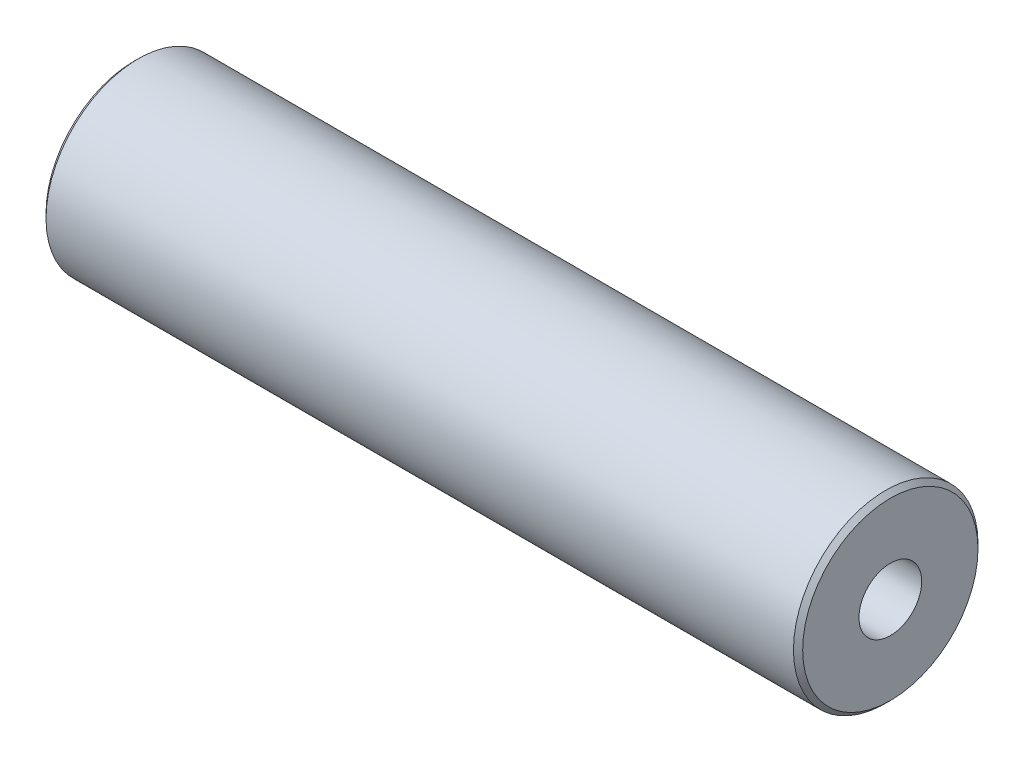
ISO-10303-21;
HEADER;
FILE_DESCRIPTION(('STEP AP214'),'2;1');
FILE_NAME('part.step','',(''),(''),'','','');
FILE_SCHEMA(('AUTOMOTIVE_DESIGN { 1 0 10303 214 1 1 1 1 }'));
ENDSEC;
DATA;
#1=APPLICATION_CONTEXT('core data for automotive mechanical design processes');
#2=APPLICATION_PROTOCOL_DEFINITION('international standard','automotive_design',2000,#1);
#3=PRODUCT_CONTEXT('',#1,'mechanical');
#4=PRODUCT('Part','Part','',(#3));
#5=PRODUCT_RELATED_PRODUCT_CATEGORY('part','',(#4));
#6=PRODUCT_DEFINITION_FORMATION('','',#4);
#7=PRODUCT_DEFINITION_CONTEXT('part definition',#1,'design');
#8=PRODUCT_DEFINITION('design','',#6,#7);
#9=PRODUCT_DEFINITION_SHAPE('','',#8);
#10=(LENGTH_UNIT() NAMED_UNIT(*) SI_UNIT(.MILLI.,.METRE.));
#11=(NAMED_UNIT(*) PLANE_ANGLE_UNIT() SI_UNIT($,.RADIAN.));
#12=(NAMED_UNIT(*) SI_UNIT($,.STERADIAN.) SOLID_ANGLE_UNIT());
#13=UNCERTAINTY_MEASURE_WITH_UNIT(LENGTH_MEASURE(1.E-05),#10,'distance_accuracy_value','');
#14=(GEOMETRIC_REPRESENTATION_CONTEXT(3) GLOBAL_UNCERTAINTY_ASSIGNED_CONTEXT((#13)) GLOBAL_UNIT_ASSIGNED_CONTEXT((#10,
#11,#12)) REPRESENTATION_CONTEXT('',''));
#15=CARTESIAN_POINT('',(0.,0.,0.));
#16=DIRECTION('',(0.,0.,1.));
#17=DIRECTION('',(1.,0.,0.));
#18=AXIS2_PLACEMENT_3D('',#15,#16,#17);
#19=CARTESIAN_POINT('',(41.,0.,0.));
#20=DIRECTION('',(-1.,0.,0.));
#21=DIRECTION('',(0.,0.,1.));
#22=AXIS2_PLACEMENT_3D('',#19,#20,#21);
#23=CYLINDRICAL_SURFACE('',#22,10.);
#24=CARTESIAN_POINT('',(40.5,0.,0.));
#25=DIRECTION('',(1.,0.,0.));
#26=DIRECTION('',(0.,0.,-1.));
#27=AXIS2_PLACEMENT_3D('',#24,#25,#26);
#28=CIRCLE('',#27,10.);
#29=CARTESIAN_POINT('',(40.5,0.,-10.));
#30=VERTEX_POINT('',#29);
#31=EDGE_CURVE('E75',#30,#30,#28,.F.);
#32=ORIENTED_EDGE('',*,*,#31,.T.);
#33=EDGE_LOOP('',(#32));
#34=FACE_BOUND('',#33,.T.);
#35=CARTESIAN_POINT('',(-40.5,0.,0.));
#36=DIRECTION('',(1.,0.,0.));
#37=DIRECTION('',(0.,0.,-1.));
#38=AXIS2_PLACEMENT_3D('',#35,#36,#37);
#39=CIRCLE('',#38,10.);
#40=CARTESIAN_POINT('',(-40.5,0.,-10.));
#41=VERTEX_POINT('',#40);
#42=EDGE_CURVE('E111',#41,#41,#39,.T.);
#43=ORIENTED_EDGE('',*,*,#42,.T.);
#44=EDGE_LOOP('',(#43));
#45=FACE_BOUND('',#44,.T.);
#46=ADVANCED_FACE('F65',(#34,#45),#23,.T.);
#47=CARTESIAN_POINT('',(41.,0.,0.));
#48=DIRECTION('',(1.,0.,0.));
#49=DIRECTION('',(0.,0.,-1.));
#50=AXIS2_PLACEMENT_3D('',#47,#48,#49);
#51=PLANE('',#50);
#52=CARTESIAN_POINT('',(41.,0.,0.));
#53=DIRECTION('',(1.,0.,0.));
#54=DIRECTION('',(0.,0.,-1.));
#55=AXIS2_PLACEMENT_3D('',#52,#53,#54);
#56=CIRCLE('',#55,3.4);
#57=CARTESIAN_POINT('',(41.,0.,-3.4));
#58=VERTEX_POINT('',#57);
#59=EDGE_CURVE('E92',#58,#58,#56,.T.);
#60=ORIENTED_EDGE('',*,*,#59,.F.);
#61=EDGE_LOOP('',(#60));
#62=FACE_BOUND('',#61,.T.);
#63=CARTESIAN_POINT('',(41.,0.,0.));
#64=DIRECTION('',(1.,0.,0.));
#65=DIRECTION('',(0.,0.,-1.));
#66=AXIS2_PLACEMENT_3D('',#63,#64,#65);
#67=CIRCLE('',#66,9.5);
#68=CARTESIAN_POINT('',(41.,0.,-9.5));
#69=VERTEX_POINT('',#68);
#70=EDGE_CURVE('E107',#69,#69,#67,.T.);
#71=ORIENTED_EDGE('',*,*,#70,.T.);
#72=EDGE_LOOP('',(#71));
#73=FACE_BOUND('',#72,.T.);
#74=ADVANCED_FACE('F127',(#62,#73),#51,.T.);
#75=CARTESIAN_POINT('',(-41.,0.,0.));
#76=DIRECTION('',(1.,0.,0.));
#77=DIRECTION('',(0.,0.,-1.));
#78=AXIS2_PLACEMENT_3D('',#75,#76,#77);
#79=PLANE('',#78);
#80=CARTESIAN_POINT('',(-41.,0.,0.));
#81=DIRECTION('',(-1.,0.,0.));
#82=DIRECTION('',(0.,0.,1.));
#83=AXIS2_PLACEMENT_3D('',#80,#81,#82);
#84=CIRCLE('',#83,3.39999999999999);
#85=CARTESIAN_POINT('',(-41.,0.,3.39999999999999));
#86=VERTEX_POINT('',#85);
#87=EDGE_CURVE('E93',#86,#86,#84,.T.);
#88=ORIENTED_EDGE('',*,*,#87,.F.);
#89=EDGE_LOOP('',(#88));
#90=FACE_BOUND('',#89,.T.);
#91=CARTESIAN_POINT('',(-41.,0.,0.));
#92=DIRECTION('',(1.,0.,0.));
#93=DIRECTION('',(0.,0.,-1.));
#94=AXIS2_PLACEMENT_3D('',#91,#92,#93);
#95=CIRCLE('',#94,9.49999999999999);
#96=CARTESIAN_POINT('',(-41.,0.,-9.49999999999999));
#97=VERTEX_POINT('',#96);
#98=EDGE_CURVE('E13',#97,#97,#95,.F.);
#99=ORIENTED_EDGE('',*,*,#98,.T.);
#100=EDGE_LOOP('',(#99));
#101=FACE_BOUND('',#100,.T.);
#102=ADVANCED_FACE('F124',(#90,#101),#79,.F.);
#103=CARTESIAN_POINT('',(41.,0.,0.));
#104=DIRECTION('',(-1.,0.,0.));
#105=DIRECTION('',(0.,0.,1.));
#106=AXIS2_PLACEMENT_3D('',#103,#104,#105);
#107=CONICAL_SURFACE('',#106,9.5,0.785398163397447);
#108=ORIENTED_EDGE('',*,*,#31,.F.);
#109=EDGE_LOOP('',(#108));
#110=FACE_BOUND('',#109,.T.);
#111=ORIENTED_EDGE('',*,*,#70,.F.);
#112=EDGE_LOOP('',(#111));
#113=FACE_BOUND('',#112,.T.);
#114=ADVANCED_FACE('F121',(#110,#113),#107,.T.);
#115=CARTESIAN_POINT('',(-40.5,0.,0.));
#116=DIRECTION('',(1.,0.,0.));
#117=DIRECTION('',(0.,0.,-1.));
#118=AXIS2_PLACEMENT_3D('',#115,#116,#117);
#119=CONICAL_SURFACE('',#118,10.,0.785398163397447);
#120=ORIENTED_EDGE('',*,*,#98,.F.);
#121=EDGE_LOOP('',(#120));
#122=FACE_BOUND('',#121,.T.);
#123=ORIENTED_EDGE('',*,*,#42,.F.);
#124=EDGE_LOOP('',(#123));
#125=FACE_BOUND('',#124,.T.);
#126=ADVANCED_FACE('F68',(#122,#125),#119,.T.);
#127=CARTESIAN_POINT('',(18.75,0.,0.));
#128=DIRECTION('',(1.,0.,0.));
#129=DIRECTION('',(0.,0.,-1.));
#130=AXIS2_PLACEMENT_3D('',#127,#128,#129);
#131=CONICAL_SURFACE('',#130,3.4,1.02974425867665);
#132=CARTESIAN_POINT('',(16.7070738953063,0.,0.));
#133=VERTEX_POINT('',#132);
#134=VERTEX_LOOP('',#133);
#135=FACE_BOUND('',#134,.T.);
#136=CARTESIAN_POINT('',(18.75,0.,0.));
#137=DIRECTION('',(1.,0.,0.));
#138=DIRECTION('',(0.,0.,-1.));
#139=AXIS2_PLACEMENT_3D('',#136,#137,#138);
#140=CIRCLE('',#139,3.4);
#141=CARTESIAN_POINT('',(18.75,0.,-3.4));
#142=VERTEX_POINT('',#141);
#143=EDGE_CURVE('E99',#142,#142,#140,.T.);
#144=ORIENTED_EDGE('',*,*,#143,.T.);
#145=EDGE_LOOP('',(#144));
#146=FACE_BOUND('',#145,.T.);
#147=ADVANCED_FACE('F141',(#135,#146),#131,.F.);
#148=CARTESIAN_POINT('',(41.,0.,0.));
#149=DIRECTION('',(1.,0.,0.));
#150=DIRECTION('',(0.,0.,-1.));
#151=AXIS2_PLACEMENT_3D('',#148,#149,#150);
#152=CYLINDRICAL_SURFACE('',#151,3.4);
#153=ORIENTED_EDGE('',*,*,#143,.F.);
#154=EDGE_LOOP('',(#153));
#155=FACE_BOUND('',#154,.T.);
#156=ORIENTED_EDGE('',*,*,#59,.T.);
#157=EDGE_LOOP('',(#156));
#158=FACE_BOUND('',#157,.T.);
#159=ADVANCED_FACE('F85',(#155,#158),#152,.F.);
#160=CARTESIAN_POINT('',(-18.75,0.,0.));
#161=DIRECTION('',(-1.,0.,0.));
#162=DIRECTION('',(0.,0.,1.));
#163=AXIS2_PLACEMENT_3D('',#160,#161,#162);
#164=CONICAL_SURFACE('',#163,3.39999999999999,1.02974425867665);
#165=CARTESIAN_POINT('',(-16.7070738953063,0.,0.));
#166=VERTEX_POINT('',#165);
#167=VERTEX_LOOP('',#166);
#168=FACE_BOUND('',#167,.T.);
#169=CARTESIAN_POINT('',(-18.75,0.,0.));
#170=DIRECTION('',(-1.,0.,0.));
#171=DIRECTION('',(0.,0.,1.));
#172=AXIS2_PLACEMENT_3D('',#169,#170,#171);
#173=CIRCLE('',#172,3.39999999999999);
#174=CARTESIAN_POINT('',(-18.75,0.,3.39999999999999));
#175=VERTEX_POINT('',#174);
#176=EDGE_CURVE('E89',#175,#175,#173,.T.);
#177=ORIENTED_EDGE('',*,*,#176,.T.);
#178=EDGE_LOOP('',(#177));
#179=FACE_BOUND('',#178,.T.);
#180=ADVANCED_FACE('F81',(#168,#179),#164,.F.);
#181=CARTESIAN_POINT('',(-41.,0.,0.));
#182=DIRECTION('',(-1.,0.,0.));
#183=DIRECTION('',(0.,0.,1.));
#184=AXIS2_PLACEMENT_3D('',#181,#182,#183);
#185=CYLINDRICAL_SURFACE('',#184,3.39999999999999);
#186=ORIENTED_EDGE('',*,*,#176,.F.);
#187=EDGE_LOOP('',(#186));
#188=FACE_BOUND('',#187,.T.);
#189=ORIENTED_EDGE('',*,*,#87,.T.);
#190=EDGE_LOOP('',(#189));
#191=FACE_BOUND('',#190,.T.);
#192=ADVANCED_FACE('F84',(#188,#191),#185,.F.);
#193=CLOSED_SHELL('',(#46,#74,#102,#114,#126,#147,#159,#180,#192));
#194=MANIFOLD_SOLID_BREP('B2',#193);
#195=ADVANCED_BREP_SHAPE_REPRESENTATION('',(#18,#194),#14);
#196=SHAPE_DEFINITION_REPRESENTATION(#9,#195);
ENDSEC;
END-ISO-10303-21;
